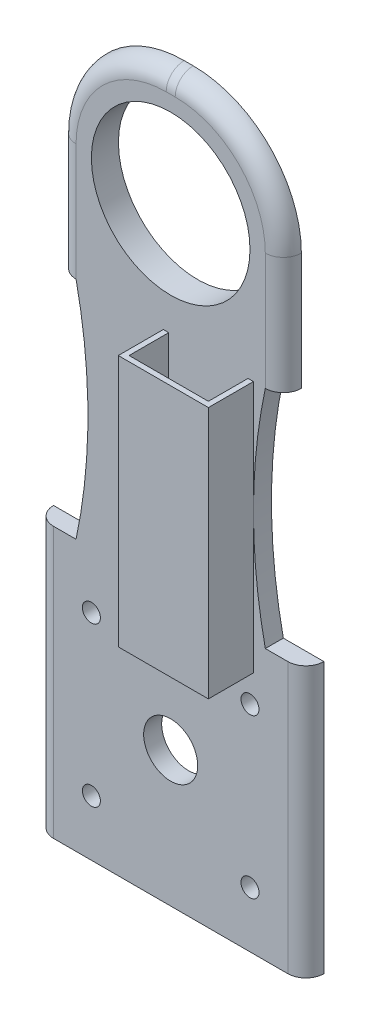
ISO-10303-21;
HEADER;
FILE_DESCRIPTION(('STEP AP214'),'2;1');
FILE_NAME('part.step','',(''),(''),'','','');
FILE_SCHEMA(('AUTOMOTIVE_DESIGN { 1 0 10303 214 1 1 1 1 }'));
ENDSEC;
DATA;
#1=APPLICATION_CONTEXT('core data for automotive mechanical design processes');
#2=APPLICATION_PROTOCOL_DEFINITION('international standard','automotive_design',2000,#1);
#3=PRODUCT_CONTEXT('',#1,'mechanical');
#4=PRODUCT('Part','Part','',(#3));
#5=PRODUCT_RELATED_PRODUCT_CATEGORY('part','',(#4));
#6=PRODUCT_DEFINITION_FORMATION('','',#4);
#7=PRODUCT_DEFINITION_CONTEXT('part definition',#1,'design');
#8=PRODUCT_DEFINITION('design','',#6,#7);
#9=PRODUCT_DEFINITION_SHAPE('','',#8);
#10=(LENGTH_UNIT() NAMED_UNIT(*) SI_UNIT(.MILLI.,.METRE.));
#11=(NAMED_UNIT(*) PLANE_ANGLE_UNIT() SI_UNIT($,.RADIAN.));
#12=(NAMED_UNIT(*) SI_UNIT($,.STERADIAN.) SOLID_ANGLE_UNIT());
#13=UNCERTAINTY_MEASURE_WITH_UNIT(LENGTH_MEASURE(1.E-05),#10,'distance_accuracy_value','');
#14=(GEOMETRIC_REPRESENTATION_CONTEXT(3) GLOBAL_UNCERTAINTY_ASSIGNED_CONTEXT((#13)) GLOBAL_UNIT_ASSIGNED_CONTEXT((#10,
#11,#12)) REPRESENTATION_CONTEXT('',''));
#15=CARTESIAN_POINT('',(0.,0.,0.));
#16=DIRECTION('',(0.,0.,1.));
#17=DIRECTION('',(1.,0.,0.));
#18=AXIS2_PLACEMENT_3D('',#15,#16,#17);
#19=CARTESIAN_POINT('',(10.9010106738399,-22.225,0.));
#20=DIRECTION('',(1.,0.,0.));
#21=DIRECTION('',(0.,1.,0.));
#22=AXIS2_PLACEMENT_3D('',#19,#20,#21);
#23=PLANE('',#22);
#24=DIRECTION('',(0.,-1.,0.));
#25=VECTOR('',#24,1.);
#26=CARTESIAN_POINT('',(10.9010106738399,-22.225,8.128));
#27=LINE('',#26,#25);
#28=CARTESIAN_POINT('',(10.90101067384,-15.875,8.128));
#29=VERTEX_POINT('',#28);
#30=CARTESIAN_POINT('',(10.9010106738399,-51.435,8.128));
#31=VERTEX_POINT('',#30);
#32=EDGE_CURVE('E84',#29,#31,#27,.T.);
#33=ORIENTED_EDGE('',*,*,#32,.F.);
#34=DIRECTION('',(0.,0.,1.));
#35=VECTOR('',#34,1.);
#36=CARTESIAN_POINT('',(10.90101067384,-15.875,8.89000000000002));
#37=LINE('',#36,#35);
#38=CARTESIAN_POINT('',(10.90101067384,-15.875,2.54));
#39=VERTEX_POINT('',#38);
#40=EDGE_CURVE('E530',#39,#29,#37,.T.);
#41=ORIENTED_EDGE('',*,*,#40,.F.);
#42=DIRECTION('',(0.,1.,0.));
#43=VECTOR('',#42,1.);
#44=CARTESIAN_POINT('',(10.9010106738399,-15.875,2.54));
#45=LINE('',#44,#43);
#46=CARTESIAN_POINT('',(10.9010106738399,-22.225,2.54));
#47=VERTEX_POINT('',#46);
#48=EDGE_CURVE('E253',#47,#39,#45,.T.);
#49=ORIENTED_EDGE('',*,*,#48,.F.);
#50=DIRECTION('',(0.,0.,1.));
#51=VECTOR('',#50,1.);
#52=CARTESIAN_POINT('',(10.9010106738399,-22.225,0.));
#53=LINE('',#52,#51);
#54=CARTESIAN_POINT('',(10.9010106738399,-22.225,0.));
#55=VERTEX_POINT('',#54);
#56=EDGE_CURVE('E308',#55,#47,#53,.T.);
#57=ORIENTED_EDGE('',*,*,#56,.F.);
#58=DIRECTION('',(0.,1.,0.));
#59=VECTOR('',#58,1.);
#60=CARTESIAN_POINT('',(10.9010106738399,-22.225,0.));
#61=LINE('',#60,#59);
#62=CARTESIAN_POINT('',(10.9010106738399,-29.591,0.));
#63=VERTEX_POINT('',#62);
#64=EDGE_CURVE('E292',#63,#55,#61,.T.);
#65=ORIENTED_EDGE('',*,*,#64,.F.);
#66=DIRECTION('',(0.,0.,1.));
#67=VECTOR('',#66,1.);
#68=CARTESIAN_POINT('',(10.9010106738399,-29.591,0.));
#69=LINE('',#68,#67);
#70=CARTESIAN_POINT('',(10.9010106738399,-29.591,2.54));
#71=VERTEX_POINT('',#70);
#72=EDGE_CURVE('E311',#63,#71,#69,.T.);
#73=ORIENTED_EDGE('',*,*,#72,.T.);
#74=CARTESIAN_POINT('',(10.90101067384,-51.435,2.54));
#75=VERTEX_POINT('',#74);
#76=EDGE_CURVE('E515',#75,#71,#45,.T.);
#77=ORIENTED_EDGE('',*,*,#76,.F.);
#78=DIRECTION('',(0.,0.,1.));
#79=VECTOR('',#78,1.);
#80=CARTESIAN_POINT('',(10.9010106738399,-51.435,8.89));
#81=LINE('',#80,#79);
#82=EDGE_CURVE('E80',#75,#31,#81,.T.);
#83=ORIENTED_EDGE('',*,*,#82,.T.);
#84=EDGE_LOOP('',(#33,#41,#49,#57,#65,#73,#77,#83));
#85=FACE_BOUND('',#84,.T.);
#86=ADVANCED_FACE('F65',(#85),#23,.F.);
#87=CARTESIAN_POINT('',(-0.274989326160059,-15.875,8.89));
#88=DIRECTION('',(1.,0.,0.));
#89=DIRECTION('',(0.,1.,0.));
#90=AXIS2_PLACEMENT_3D('',#87,#88,#89);
#91=PLANE('',#90);
#92=DIRECTION('',(0.,0.,-1.));
#93=VECTOR('',#92,1.);
#94=CARTESIAN_POINT('',(-0.274989326160028,-15.875,8.89));
#95=LINE('',#94,#93);
#96=CARTESIAN_POINT('',(-0.274989326160028,-15.875,8.128));
#97=VERTEX_POINT('',#96);
#98=CARTESIAN_POINT('',(-0.274989326160027,-15.875,2.54));
#99=VERTEX_POINT('',#98);
#100=EDGE_CURVE('E254',#97,#99,#95,.T.);
#101=ORIENTED_EDGE('',*,*,#100,.F.);
#102=DIRECTION('',(0.,-1.,0.));
#103=VECTOR('',#102,1.);
#104=CARTESIAN_POINT('',(-0.274989326160059,-15.875,8.128));
#105=LINE('',#104,#103);
#106=CARTESIAN_POINT('',(-0.274989326160055,-51.435,8.128));
#107=VERTEX_POINT('',#106);
#108=EDGE_CURVE('E12',#97,#107,#105,.T.);
#109=ORIENTED_EDGE('',*,*,#108,.T.);
#110=DIRECTION('',(0.,0.,-1.));
#111=VECTOR('',#110,1.);
#112=CARTESIAN_POINT('',(-0.274989326160056,-51.435,8.89));
#113=LINE('',#112,#111);
#114=CARTESIAN_POINT('',(-0.274989326160055,-51.435,2.54));
#115=VERTEX_POINT('',#114);
#116=EDGE_CURVE('E233',#107,#115,#113,.T.);
#117=ORIENTED_EDGE('',*,*,#116,.T.);
#118=DIRECTION('',(0.,-1.,0.));
#119=VECTOR('',#118,1.);
#120=CARTESIAN_POINT('',(-0.274989326160059,-15.875,2.54));
#121=LINE('',#120,#119);
#122=EDGE_CURVE('E236',#99,#115,#121,.T.);
#123=ORIENTED_EDGE('',*,*,#122,.F.);
#124=EDGE_LOOP('',(#101,#109,#117,#123));
#125=FACE_BOUND('',#124,.T.);
#126=ADVANCED_FACE('F235',(#125),#91,.T.);
#127=CARTESIAN_POINT('',(0.635000000000004,0.635000000000004,0.));
#128=DIRECTION('',(0.,0.,-1.));
#129=DIRECTION('',(-1.,0.,0.));
#130=AXIS2_PLACEMENT_3D('',#127,#128,#129);
#131=PLANE('',#130);
#132=DIRECTION('',(0.,-1.,0.));
#133=VECTOR('',#132,1.);
#134=CARTESIAN_POINT('',(3.53501067383994,-22.225,0.));
#135=LINE('',#134,#133);
#136=CARTESIAN_POINT('',(3.53501067383994,-22.225,0.));
#137=VERTEX_POINT('',#136);
#138=CARTESIAN_POINT('',(3.53501067383994,-29.591,0.));
#139=VERTEX_POINT('',#138);
#140=EDGE_CURVE('E285',#137,#139,#135,.T.);
#141=ORIENTED_EDGE('',*,*,#140,.T.);
#142=DIRECTION('',(1.,0.,0.));
#143=VECTOR('',#142,1.);
#144=CARTESIAN_POINT('',(3.53501067383994,-29.591,0.));
#145=LINE('',#144,#143);
#146=EDGE_CURVE('E288',#139,#63,#145,.T.);
#147=ORIENTED_EDGE('',*,*,#146,.T.);
#148=ORIENTED_EDGE('',*,*,#64,.T.);
#149=DIRECTION('',(-1.,0.,0.));
#150=VECTOR('',#149,1.);
#151=CARTESIAN_POINT('',(3.53501067383994,-22.225,0.));
#152=LINE('',#151,#150);
#153=EDGE_CURVE('E295',#55,#137,#152,.T.);
#154=ORIENTED_EDGE('',*,*,#153,.T.);
#155=EDGE_LOOP('',(#141,#147,#148,#154));
#156=FACE_BOUND('',#155,.T.);
#157=CARTESIAN_POINT('',(0.,-66.675,0.));
#158=DIRECTION('',(0.,0.,1.));
#159=DIRECTION('',(1.,0.,0.));
#160=AXIS2_PLACEMENT_3D('',#157,#158,#159);
#161=CIRCLE('',#160,3.81);
#162=CARTESIAN_POINT('',(3.81,-66.675,0.));
#163=VERTEX_POINT('',#162);
#164=EDGE_CURVE('E329',#163,#163,#161,.T.);
#165=ORIENTED_EDGE('',*,*,#164,.T.);
#166=EDGE_LOOP('',(#165));
#167=FACE_BOUND('',#166,.T.);
#168=CARTESIAN_POINT('',(-11.176,-77.851,0.));
#169=DIRECTION('',(0.,0.,1.));
#170=DIRECTION('',(1.,0.,0.));
#171=AXIS2_PLACEMENT_3D('',#168,#169,#170);
#172=CIRCLE('',#171,1.27);
#173=CARTESIAN_POINT('',(-9.90600000000001,-77.851,0.));
#174=VERTEX_POINT('',#173);
#175=EDGE_CURVE('E336',#174,#174,#172,.T.);
#176=ORIENTED_EDGE('',*,*,#175,.T.);
#177=EDGE_LOOP('',(#176));
#178=FACE_BOUND('',#177,.T.);
#179=CARTESIAN_POINT('',(11.176,-55.499,0.));
#180=DIRECTION('',(0.,0.,1.));
#181=DIRECTION('',(1.,0.,0.));
#182=AXIS2_PLACEMENT_3D('',#179,#180,#181);
#183=CIRCLE('',#182,1.27);
#184=CARTESIAN_POINT('',(12.446,-55.499,0.));
#185=VERTEX_POINT('',#184);
#186=EDGE_CURVE('E348',#185,#185,#183,.T.);
#187=ORIENTED_EDGE('',*,*,#186,.T.);
#188=EDGE_LOOP('',(#187));
#189=FACE_BOUND('',#188,.T.);
#190=DIRECTION('',(0.,1.,0.));
#191=VECTOR('',#190,1.);
#192=CARTESIAN_POINT('',(15.875,-15.875,0.));
#193=LINE('',#192,#191);
#194=CARTESIAN_POINT('',(15.875,-15.875,0.));
#195=VERTEX_POINT('',#194);
#196=CARTESIAN_POINT('',(15.875,0.634999999999897,0.));
#197=VERTEX_POINT('',#196);
#198=EDGE_CURVE('E359',#195,#197,#193,.T.);
#199=ORIENTED_EDGE('',*,*,#198,.F.);
#200=DIRECTION('',(1.,0.,0.));
#201=VECTOR('',#200,1.);
#202=CARTESIAN_POINT('',(15.875,-15.875,0.));
#203=LINE('',#202,#201);
#204=CARTESIAN_POINT('',(13.335,-15.875,0.));
#205=VERTEX_POINT('',#204);
#206=EDGE_CURVE('E363',#205,#195,#203,.T.);
#207=ORIENTED_EDGE('',*,*,#206,.F.);
#208=CARTESIAN_POINT('',(87.8630106738399,-31.75,0.));
#209=DIRECTION('',(0.,0.,-1.));
#210=DIRECTION('',(1.,0.,0.));
#211=AXIS2_PLACEMENT_3D('',#208,#209,#210);
#212=CIRCLE('',#211,76.2);
#213=CARTESIAN_POINT('',(13.335,-47.625,0.));
#214=VERTEX_POINT('',#213);
#215=EDGE_CURVE('E406',#214,#205,#212,.T.);
#216=ORIENTED_EDGE('',*,*,#215,.F.);
#217=DIRECTION('',(-1.,0.,0.));
#218=VECTOR('',#217,1.);
#219=CARTESIAN_POINT('',(19.05,-47.625,0.));
#220=LINE('',#219,#218);
#221=CARTESIAN_POINT('',(19.05,-47.625,0.));
#222=VERTEX_POINT('',#221);
#223=EDGE_CURVE('E404',#222,#214,#220,.T.);
#224=ORIENTED_EDGE('',*,*,#223,.F.);
#225=DIRECTION('',(0.,1.,0.));
#226=VECTOR('',#225,1.);
#227=CARTESIAN_POINT('',(19.05,-85.725,0.));
#228=LINE('',#227,#226);
#229=CARTESIAN_POINT('',(19.05,-85.725,0.));
#230=VERTEX_POINT('',#229);
#231=EDGE_CURVE('E401',#230,#222,#228,.T.);
#232=ORIENTED_EDGE('',*,*,#231,.F.);
#233=DIRECTION('',(1.,0.,0.));
#234=VECTOR('',#233,1.);
#235=CARTESIAN_POINT('',(19.05,-85.725,0.));
#236=LINE('',#235,#234);
#237=CARTESIAN_POINT('',(-19.05,-85.725,0.));
#238=VERTEX_POINT('',#237);
#239=EDGE_CURVE('E399',#238,#230,#236,.T.);
#240=ORIENTED_EDGE('',*,*,#239,.F.);
#241=DIRECTION('',(0.,-1.,0.));
#242=VECTOR('',#241,1.);
#243=CARTESIAN_POINT('',(-19.05,-85.725,0.));
#244=LINE('',#243,#242);
#245=CARTESIAN_POINT('',(-19.05,-47.625,0.));
#246=VERTEX_POINT('',#245);
#247=EDGE_CURVE('E396',#246,#238,#244,.T.);
#248=ORIENTED_EDGE('',*,*,#247,.F.);
#249=DIRECTION('',(-1.,0.,0.));
#250=VECTOR('',#249,1.);
#251=CARTESIAN_POINT('',(-13.335,-47.625,0.));
#252=LINE('',#251,#250);
#253=CARTESIAN_POINT('',(-13.335,-47.625,0.));
#254=VERTEX_POINT('',#253);
#255=EDGE_CURVE('E394',#254,#246,#252,.T.);
#256=ORIENTED_EDGE('',*,*,#255,.F.);
#257=CARTESIAN_POINT('',(-87.8630106738399,-31.75,0.));
#258=DIRECTION('',(0.,0.,-1.));
#259=DIRECTION('',(-1.,0.,0.));
#260=AXIS2_PLACEMENT_3D('',#257,#258,#259);
#261=CIRCLE('',#260,76.2);
#262=CARTESIAN_POINT('',(-13.335,-15.875,0.));
#263=VERTEX_POINT('',#262);
#264=EDGE_CURVE('E392',#263,#254,#261,.T.);
#265=ORIENTED_EDGE('',*,*,#264,.F.);
#266=DIRECTION('',(1.,0.,0.));
#267=VECTOR('',#266,1.);
#268=CARTESIAN_POINT('',(-13.335,-15.875,0.));
#269=LINE('',#268,#267);
#270=CARTESIAN_POINT('',(-15.875,-15.875,0.));
#271=VERTEX_POINT('',#270);
#272=EDGE_CURVE('E390',#271,#263,#269,.T.);
#273=ORIENTED_EDGE('',*,*,#272,.F.);
#274=DIRECTION('',(0.,-1.,0.));
#275=VECTOR('',#274,1.);
#276=CARTESIAN_POINT('',(-15.875,-15.875,0.));
#277=LINE('',#276,#275);
#278=CARTESIAN_POINT('',(-15.875,0.634999999999894,0.));
#279=VERTEX_POINT('',#278);
#280=EDGE_CURVE('E387',#279,#271,#277,.T.);
#281=ORIENTED_EDGE('',*,*,#280,.F.);
#282=CARTESIAN_POINT('',(-0.635000000000004,0.635000000000002,0.));
#283=DIRECTION('',(0.,0.,1.));
#284=DIRECTION('',(-1.,0.,0.));
#285=AXIS2_PLACEMENT_3D('',#282,#283,#284);
#286=CIRCLE('',#285,15.24);
#287=CARTESIAN_POINT('',(-0.634999999999896,15.875,0.));
#288=VERTEX_POINT('',#287);
#289=EDGE_CURVE('E384',#288,#279,#286,.T.);
#290=ORIENTED_EDGE('',*,*,#289,.F.);
#291=DIRECTION('',(-1.,0.,0.));
#292=VECTOR('',#291,1.);
#293=CARTESIAN_POINT('',(0.634999999999891,15.875,0.));
#294=LINE('',#293,#292);
#295=CARTESIAN_POINT('',(0.634999999999891,15.875,0.));
#296=VERTEX_POINT('',#295);
#297=EDGE_CURVE('E381',#296,#288,#294,.T.);
#298=ORIENTED_EDGE('',*,*,#297,.F.);
#299=CARTESIAN_POINT('',(0.635000000000004,0.635000000000004,0.));
#300=DIRECTION('',(0.,0.,1.));
#301=DIRECTION('',(-1.,0.,0.));
#302=AXIS2_PLACEMENT_3D('',#299,#300,#301);
#303=CIRCLE('',#302,15.24);
#304=EDGE_CURVE('E378',#197,#296,#303,.T.);
#305=ORIENTED_EDGE('',*,*,#304,.F.);
#306=EDGE_LOOP('',(#199,#207,#216,#224,#232,#240,#248,#256,#265,#273,#281,#290,#298,#305));
#307=FACE_BOUND('',#306,.T.);
#308=CARTESIAN_POINT('',(11.176,-77.851,0.));
#309=DIRECTION('',(0.,0.,1.));
#310=DIRECTION('',(1.,0.,0.));
#311=AXIS2_PLACEMENT_3D('',#308,#309,#310);
#312=CIRCLE('',#311,1.27);
#313=CARTESIAN_POINT('',(12.446,-77.851,0.));
#314=VERTEX_POINT('',#313);
#315=EDGE_CURVE('E342',#314,#314,#312,.T.);
#316=ORIENTED_EDGE('',*,*,#315,.T.);
#317=EDGE_LOOP('',(#316));
#318=FACE_BOUND('',#317,.T.);
#319=CARTESIAN_POINT('',(-11.176,-55.499,0.));
#320=DIRECTION('',(0.,0.,1.));
#321=DIRECTION('',(1.,0.,0.));
#322=AXIS2_PLACEMENT_3D('',#319,#320,#321);
#323=CIRCLE('',#322,1.27);
#324=CARTESIAN_POINT('',(-9.90600000000001,-55.499,0.));
#325=VERTEX_POINT('',#324);
#326=EDGE_CURVE('E328',#325,#325,#323,.T.);
#327=ORIENTED_EDGE('',*,*,#326,.T.);
#328=EDGE_LOOP('',(#327));
#329=FACE_BOUND('',#328,.T.);
#330=CARTESIAN_POINT('',(0.,0.,0.));
#331=DIRECTION('',(0.,0.,-1.));
#332=DIRECTION('',(-1.,0.,0.));
#333=AXIS2_PLACEMENT_3D('',#330,#331,#332);
#334=CIRCLE('',#333,13.716);
#335=CARTESIAN_POINT('',(-13.716,0.,0.));
#336=VERTEX_POINT('',#335);
#337=EDGE_CURVE('E318',#336,#336,#334,.T.);
#338=ORIENTED_EDGE('',*,*,#337,.F.);
#339=EDGE_LOOP('',(#338));
#340=FACE_BOUND('',#339,.T.);
#341=ADVANCED_FACE('F490',(#156,#167,#178,#189,#307,#318,#329,#340),#131,.T.);
#342=CARTESIAN_POINT('',(0.635000000000004,0.635000000000004,2.54));
#343=DIRECTION('',(0.,0.,-1.));
#344=DIRECTION('',(-1.,0.,0.));
#345=AXIS2_PLACEMENT_3D('',#342,#343,#344);
#346=PLANE('',#345);
#347=ORIENTED_EDGE('',*,*,#48,.T.);
#348=DIRECTION('',(-1.,0.,0.));
#349=VECTOR('',#348,1.);
#350=CARTESIAN_POINT('',(-1.03698932616006,-15.875,2.54));
#351=LINE('',#350,#349);
#352=CARTESIAN_POINT('',(11.6630106738399,-15.875,2.54));
#353=VERTEX_POINT('',#352);
#354=EDGE_CURVE('E272',#353,#39,#351,.T.);
#355=ORIENTED_EDGE('',*,*,#354,.F.);
#356=DIRECTION('',(0.,1.,0.));
#357=VECTOR('',#356,1.);
#358=CARTESIAN_POINT('',(11.6630106738399,-15.875,2.54));
#359=LINE('',#358,#357);
#360=CARTESIAN_POINT('',(11.6630106738399,-31.75,2.54));
#361=VERTEX_POINT('',#360);
#362=EDGE_CURVE('E260',#361,#353,#359,.T.);
#363=ORIENTED_EDGE('',*,*,#362,.F.);
#364=CARTESIAN_POINT('',(87.8630106738399,-31.75,2.54));
#365=DIRECTION('',(0.,0.,-1.));
#366=DIRECTION('',(1.,0.,0.));
#367=AXIS2_PLACEMENT_3D('',#364,#365,#366);
#368=CIRCLE('',#367,76.2);
#369=CARTESIAN_POINT('',(13.335,-15.875,2.54));
#370=VERTEX_POINT('',#369);
#371=EDGE_CURVE('E371',#361,#370,#368,.T.);
#372=ORIENTED_EDGE('',*,*,#371,.T.);
#373=DIRECTION('',(0.,1.,0.));
#374=VECTOR('',#373,1.);
#375=CARTESIAN_POINT('',(13.335,0.635000000000004,2.54));
#376=LINE('',#375,#374);
#377=CARTESIAN_POINT('',(13.335,0.634999999999897,2.54));
#378=VERTEX_POINT('',#377);
#379=EDGE_CURVE('E442',#370,#378,#376,.T.);
#380=ORIENTED_EDGE('',*,*,#379,.T.);
#381=CARTESIAN_POINT('',(0.635000000000004,0.635000000000004,2.54));
#382=DIRECTION('',(0.,0.,-1.));
#383=DIRECTION('',(-1.,0.,0.));
#384=AXIS2_PLACEMENT_3D('',#381,#382,#383);
#385=CIRCLE('',#384,12.7);
#386=CARTESIAN_POINT('',(0.63499999999991,13.335,2.54));
#387=VERTEX_POINT('',#386);
#388=EDGE_CURVE('E440',#378,#387,#385,.F.);
#389=ORIENTED_EDGE('',*,*,#388,.T.);
#390=DIRECTION('',(-1.,0.,0.));
#391=VECTOR('',#390,1.);
#392=CARTESIAN_POINT('',(0.635000000000004,13.335,2.54));
#393=LINE('',#392,#391);
#394=CARTESIAN_POINT('',(-0.634999999999896,13.335,2.54));
#395=VERTEX_POINT('',#394);
#396=EDGE_CURVE('E438',#387,#395,#393,.T.);
#397=ORIENTED_EDGE('',*,*,#396,.T.);
#398=CARTESIAN_POINT('',(-0.635000000000004,0.635000000000002,2.54));
#399=DIRECTION('',(0.,0.,-1.));
#400=DIRECTION('',(-1.,0.,0.));
#401=AXIS2_PLACEMENT_3D('',#398,#399,#400);
#402=CIRCLE('',#401,12.7);
#403=CARTESIAN_POINT('',(-13.335,0.634999999999912,2.54));
#404=VERTEX_POINT('',#403);
#405=EDGE_CURVE('E436',#395,#404,#402,.F.);
#406=ORIENTED_EDGE('',*,*,#405,.T.);
#407=DIRECTION('',(0.,-1.,0.));
#408=VECTOR('',#407,1.);
#409=CARTESIAN_POINT('',(-13.335,0.635000000000004,2.54));
#410=LINE('',#409,#408);
#411=CARTESIAN_POINT('',(-13.335,-15.875,2.54));
#412=VERTEX_POINT('',#411);
#413=EDGE_CURVE('E434',#404,#412,#410,.T.);
#414=ORIENTED_EDGE('',*,*,#413,.T.);
#415=CARTESIAN_POINT('',(-87.8630106738399,-31.75,2.54));
#416=DIRECTION('',(0.,0.,-1.));
#417=DIRECTION('',(-1.,0.,0.));
#418=AXIS2_PLACEMENT_3D('',#415,#416,#417);
#419=CIRCLE('',#418,76.2);
#420=CARTESIAN_POINT('',(-13.335,-47.625,2.54));
#421=VERTEX_POINT('',#420);
#422=EDGE_CURVE('E360',#412,#421,#419,.T.);
#423=ORIENTED_EDGE('',*,*,#422,.T.);
#424=DIRECTION('',(-1.,0.,0.));
#425=VECTOR('',#424,1.);
#426=CARTESIAN_POINT('',(-13.335,-47.625,2.54));
#427=LINE('',#426,#425);
#428=CARTESIAN_POINT('',(-16.51,-47.625,2.54));
#429=VERTEX_POINT('',#428);
#430=EDGE_CURVE('E362',#421,#429,#427,.T.);
#431=ORIENTED_EDGE('',*,*,#430,.T.);
#432=DIRECTION('',(0.,-1.,0.));
#433=VECTOR('',#432,1.);
#434=CARTESIAN_POINT('',(-16.51,0.635000000000005,2.54));
#435=LINE('',#434,#433);
#436=CARTESIAN_POINT('',(-16.51,-85.725,2.54));
#437=VERTEX_POINT('',#436);
#438=EDGE_CURVE('E420',#429,#437,#435,.T.);
#439=ORIENTED_EDGE('',*,*,#438,.T.);
#440=DIRECTION('',(1.,0.,0.));
#441=VECTOR('',#440,1.);
#442=CARTESIAN_POINT('',(19.05,-85.725,2.54));
#443=LINE('',#442,#441);
#444=CARTESIAN_POINT('',(16.51,-85.725,2.54));
#445=VERTEX_POINT('',#444);
#446=EDGE_CURVE('E366',#437,#445,#443,.T.);
#447=ORIENTED_EDGE('',*,*,#446,.T.);
#448=DIRECTION('',(0.,1.,0.));
#449=VECTOR('',#448,1.);
#450=CARTESIAN_POINT('',(16.51,0.635000000000004,2.54));
#451=LINE('',#450,#449);
#452=CARTESIAN_POINT('',(16.51,-47.625,2.54));
#453=VERTEX_POINT('',#452);
#454=EDGE_CURVE('E423',#445,#453,#451,.T.);
#455=ORIENTED_EDGE('',*,*,#454,.T.);
#456=DIRECTION('',(-1.,0.,0.));
#457=VECTOR('',#456,1.);
#458=CARTESIAN_POINT('',(19.05,-47.625,2.54));
#459=LINE('',#458,#457);
#460=CARTESIAN_POINT('',(13.335,-47.625,2.54));
#461=VERTEX_POINT('',#460);
#462=EDGE_CURVE('E369',#453,#461,#459,.T.);
#463=ORIENTED_EDGE('',*,*,#462,.T.);
#464=EDGE_CURVE('E372',#461,#361,#368,.T.);
#465=ORIENTED_EDGE('',*,*,#464,.T.);
#466=CARTESIAN_POINT('',(11.6630106738399,-51.435,2.54));
#467=VERTEX_POINT('',#466);
#468=EDGE_CURVE('E264',#467,#361,#359,.T.);
#469=ORIENTED_EDGE('',*,*,#468,.F.);
#470=DIRECTION('',(1.,0.,0.));
#471=VECTOR('',#470,1.);
#472=CARTESIAN_POINT('',(-1.03698932616006,-51.435,2.54));
#473=LINE('',#472,#471);
#474=EDGE_CURVE('E261',#75,#467,#473,.T.);
#475=ORIENTED_EDGE('',*,*,#474,.F.);
#476=ORIENTED_EDGE('',*,*,#76,.T.);
#477=DIRECTION('',(1.,0.,0.));
#478=VECTOR('',#477,1.);
#479=CARTESIAN_POINT('',(3.53501067383994,-29.591,2.54));
#480=LINE('',#479,#478);
#481=CARTESIAN_POINT('',(3.53501067383994,-29.591,2.54));
#482=VERTEX_POINT('',#481);
#483=EDGE_CURVE('E300',#482,#71,#480,.T.);
#484=ORIENTED_EDGE('',*,*,#483,.F.);
#485=DIRECTION('',(0.,-1.,0.));
#486=VECTOR('',#485,1.);
#487=CARTESIAN_POINT('',(3.53501067383994,-22.225,2.54));
#488=LINE('',#487,#486);
#489=CARTESIAN_POINT('',(3.53501067383994,-22.225,2.54));
#490=VERTEX_POINT('',#489);
#491=EDGE_CURVE('E284',#490,#482,#488,.T.);
#492=ORIENTED_EDGE('',*,*,#491,.F.);
#493=DIRECTION('',(-1.,0.,0.));
#494=VECTOR('',#493,1.);
#495=CARTESIAN_POINT('',(3.53501067383994,-22.225,2.54));
#496=LINE('',#495,#494);
#497=EDGE_CURVE('E289',#47,#490,#496,.T.);
#498=ORIENTED_EDGE('',*,*,#497,.F.);
#499=EDGE_LOOP('',(#347,#355,#363,#372,#380,#389,#397,#406,#414,#423,#431,#439,#447,#455,#463,
#465,#469,#475,#476,#484,#492,#498));
#500=FACE_BOUND('',#499,.T.);
#501=CARTESIAN_POINT('',(-1.03698932616006,-15.875,2.54));
#502=VERTEX_POINT('',#501);
#503=EDGE_CURVE('E252',#99,#502,#351,.T.);
#504=ORIENTED_EDGE('',*,*,#503,.F.);
#505=ORIENTED_EDGE('',*,*,#122,.T.);
#506=CARTESIAN_POINT('',(-1.03698932616006,-51.435,2.54));
#507=VERTEX_POINT('',#506);
#508=EDGE_CURVE('E249',#507,#115,#473,.T.);
#509=ORIENTED_EDGE('',*,*,#508,.F.);
#510=DIRECTION('',(0.,-1.,0.));
#511=VECTOR('',#510,1.);
#512=CARTESIAN_POINT('',(-1.03698932616006,-15.875,2.54));
#513=LINE('',#512,#511);
#514=EDGE_CURVE('E267',#502,#507,#513,.T.);
#515=ORIENTED_EDGE('',*,*,#514,.F.);
#516=EDGE_LOOP('',(#504,#505,#509,#515));
#517=FACE_BOUND('',#516,.T.);
#518=CARTESIAN_POINT('',(0.,0.,2.54));
#519=DIRECTION('',(0.,0.,1.));
#520=DIRECTION('',(1.,0.,0.));
#521=AXIS2_PLACEMENT_3D('',#518,#519,#520);
#522=CIRCLE('',#521,11.176);
#523=CARTESIAN_POINT('',(11.176,0.,2.54));
#524=VERTEX_POINT('',#523);
#525=EDGE_CURVE('E354',#524,#524,#522,.T.);
#526=ORIENTED_EDGE('',*,*,#525,.F.);
#527=EDGE_LOOP('',(#526));
#528=FACE_BOUND('',#527,.T.);
#529=CARTESIAN_POINT('',(11.176,-55.499,2.54));
#530=DIRECTION('',(0.,0.,1.));
#531=DIRECTION('',(1.,0.,0.));
#532=AXIS2_PLACEMENT_3D('',#529,#530,#531);
#533=CIRCLE('',#532,1.27);
#534=CARTESIAN_POINT('',(12.446,-55.499,2.54));
#535=VERTEX_POINT('',#534);
#536=EDGE_CURVE('E351',#535,#535,#533,.T.);
#537=ORIENTED_EDGE('',*,*,#536,.F.);
#538=EDGE_LOOP('',(#537));
#539=FACE_BOUND('',#538,.T.);
#540=CARTESIAN_POINT('',(11.176,-77.851,2.54));
#541=DIRECTION('',(0.,0.,1.));
#542=DIRECTION('',(1.,0.,0.));
#543=AXIS2_PLACEMENT_3D('',#540,#541,#542);
#544=CIRCLE('',#543,1.27);
#545=CARTESIAN_POINT('',(12.446,-77.851,2.54));
#546=VERTEX_POINT('',#545);
#547=EDGE_CURVE('E345',#546,#546,#544,.T.);
#548=ORIENTED_EDGE('',*,*,#547,.F.);
#549=EDGE_LOOP('',(#548));
#550=FACE_BOUND('',#549,.T.);
#551=CARTESIAN_POINT('',(-11.176,-77.851,2.54));
#552=DIRECTION('',(0.,0.,1.));
#553=DIRECTION('',(1.,0.,0.));
#554=AXIS2_PLACEMENT_3D('',#551,#552,#553);
#555=CIRCLE('',#554,1.27);
#556=CARTESIAN_POINT('',(-9.90600000000001,-77.851,2.54));
#557=VERTEX_POINT('',#556);
#558=EDGE_CURVE('E339',#557,#557,#555,.T.);
#559=ORIENTED_EDGE('',*,*,#558,.F.);
#560=EDGE_LOOP('',(#559));
#561=FACE_BOUND('',#560,.T.);
#562=CARTESIAN_POINT('',(-11.176,-55.499,2.54));
#563=DIRECTION('',(0.,0.,1.));
#564=DIRECTION('',(1.,0.,0.));
#565=AXIS2_PLACEMENT_3D('',#562,#563,#564);
#566=CIRCLE('',#565,1.27);
#567=CARTESIAN_POINT('',(-9.90600000000001,-55.499,2.54));
#568=VERTEX_POINT('',#567);
#569=EDGE_CURVE('E333',#568,#568,#566,.T.);
#570=ORIENTED_EDGE('',*,*,#569,.F.);
#571=EDGE_LOOP('',(#570));
#572=FACE_BOUND('',#571,.T.);
#573=CARTESIAN_POINT('',(0.,-66.675,2.54));
#574=DIRECTION('',(0.,0.,1.));
#575=DIRECTION('',(1.,0.,0.));
#576=AXIS2_PLACEMENT_3D('',#573,#574,#575);
#577=CIRCLE('',#576,3.81);
#578=CARTESIAN_POINT('',(3.81,-66.675,2.54));
#579=VERTEX_POINT('',#578);
#580=EDGE_CURVE('E325',#579,#579,#577,.T.);
#581=ORIENTED_EDGE('',*,*,#580,.F.);
#582=EDGE_LOOP('',(#581));
#583=FACE_BOUND('',#582,.T.);
#584=ADVANCED_FACE('F246',(#500,#517,#528,#539,#550,#561,#572,#583),#346,.F.);
#585=CARTESIAN_POINT('',(-13.335,-15.875,2.54));
#586=DIRECTION('',(0.,1.,0.));
#587=DIRECTION('',(-1.,0.,0.));
#588=AXIS2_PLACEMENT_3D('',#585,#586,#587);
#589=PLANE('',#588);
#590=DIRECTION('',(0.,0.,-1.));
#591=VECTOR('',#590,1.);
#592=CARTESIAN_POINT('',(-13.335,-15.875,2.54));
#593=LINE('',#592,#591);
#594=EDGE_CURVE('E417',#412,#263,#593,.T.);
#595=ORIENTED_EDGE('',*,*,#594,.F.);
#596=CARTESIAN_POINT('',(-13.335,-15.875,0.));
#597=DIRECTION('',(0.,1.,0.));
#598=DIRECTION('',(-1.,0.,0.));
#599=AXIS2_PLACEMENT_3D('',#596,#597,#598);
#600=CIRCLE('',#599,2.54);
#601=EDGE_CURVE('E73',#412,#271,#600,.F.);
#602=ORIENTED_EDGE('',*,*,#601,.T.);
#603=ORIENTED_EDGE('',*,*,#272,.T.);
#604=EDGE_LOOP('',(#595,#602,#603));
#605=FACE_BOUND('',#604,.T.);
#606=ADVANCED_FACE('F469',(#605),#589,.F.);
#607=CARTESIAN_POINT('',(-87.8630106738399,-31.75,2.54));
#608=DIRECTION('',(0.,0.,-1.));
#609=DIRECTION('',(-1.,0.,0.));
#610=AXIS2_PLACEMENT_3D('',#607,#608,#609);
#611=CYLINDRICAL_SURFACE('',#610,76.2);
#612=ORIENTED_EDGE('',*,*,#264,.T.);
#613=DIRECTION('',(0.,0.,-1.));
#614=VECTOR('',#613,1.);
#615=CARTESIAN_POINT('',(-13.335,-47.625,2.54));
#616=LINE('',#615,#614);
#617=EDGE_CURVE('E414',#421,#254,#616,.T.);
#618=ORIENTED_EDGE('',*,*,#617,.F.);
#619=ORIENTED_EDGE('',*,*,#422,.F.);
#620=ORIENTED_EDGE('',*,*,#594,.T.);
#621=EDGE_LOOP('',(#612,#618,#619,#620));
#622=FACE_BOUND('',#621,.T.);
#623=ADVANCED_FACE('F473',(#622),#611,.F.);
#624=CARTESIAN_POINT('',(-13.335,-47.625,2.54));
#625=DIRECTION('',(0.,-1.,0.));
#626=DIRECTION('',(1.,0.,0.));
#627=AXIS2_PLACEMENT_3D('',#624,#625,#626);
#628=PLANE('',#627);
#629=ORIENTED_EDGE('',*,*,#255,.T.);
#630=CARTESIAN_POINT('',(-16.51,-47.625,0.));
#631=DIRECTION('',(0.,-1.,0.));
#632=DIRECTION('',(1.,0.,0.));
#633=AXIS2_PLACEMENT_3D('',#630,#631,#632);
#634=CIRCLE('',#633,2.54);
#635=EDGE_CURVE('E432',#246,#429,#634,.F.);
#636=ORIENTED_EDGE('',*,*,#635,.T.);
#637=ORIENTED_EDGE('',*,*,#430,.F.);
#638=ORIENTED_EDGE('',*,*,#617,.T.);
#639=EDGE_LOOP('',(#629,#636,#637,#638));
#640=FACE_BOUND('',#639,.T.);
#641=ADVANCED_FACE('F477',(#640),#628,.F.);
#642=CARTESIAN_POINT('',(19.05,-85.725,2.54));
#643=DIRECTION('',(0.,1.,0.));
#644=DIRECTION('',(0.,0.,1.));
#645=AXIS2_PLACEMENT_3D('',#642,#643,#644);
#646=PLANE('',#645);
#647=ORIENTED_EDGE('',*,*,#239,.T.);
#648=CARTESIAN_POINT('',(16.51,-85.725,0.));
#649=DIRECTION('',(0.,1.,0.));
#650=DIRECTION('',(0.,0.,1.));
#651=AXIS2_PLACEMENT_3D('',#648,#649,#650);
#652=CIRCLE('',#651,2.54);
#653=EDGE_CURVE('E430',#230,#445,#652,.F.);
#654=ORIENTED_EDGE('',*,*,#653,.T.);
#655=ORIENTED_EDGE('',*,*,#446,.F.);
#656=CARTESIAN_POINT('',(-16.51,-85.725,0.));
#657=DIRECTION('',(0.,1.,0.));
#658=DIRECTION('',(0.,0.,1.));
#659=AXIS2_PLACEMENT_3D('',#656,#657,#658);
#660=CIRCLE('',#659,2.54);
#661=EDGE_CURVE('E428',#437,#238,#660,.F.);
#662=ORIENTED_EDGE('',*,*,#661,.T.);
#663=EDGE_LOOP('',(#647,#654,#655,#662));
#664=FACE_BOUND('',#663,.T.);
#665=ADVANCED_FACE('F486',(#664),#646,.F.);
#666=CARTESIAN_POINT('',(19.05,-47.625,2.54));
#667=DIRECTION('',(0.,-1.,0.));
#668=DIRECTION('',(1.,0.,0.));
#669=AXIS2_PLACEMENT_3D('',#666,#667,#668);
#670=PLANE('',#669);
#671=ORIENTED_EDGE('',*,*,#462,.F.);
#672=CARTESIAN_POINT('',(16.51,-47.625,0.));
#673=DIRECTION('',(0.,-1.,0.));
#674=DIRECTION('',(1.,0.,0.));
#675=AXIS2_PLACEMENT_3D('',#672,#673,#674);
#676=CIRCLE('',#675,2.54);
#677=EDGE_CURVE('E426',#453,#222,#676,.F.);
#678=ORIENTED_EDGE('',*,*,#677,.T.);
#679=ORIENTED_EDGE('',*,*,#223,.T.);
#680=DIRECTION('',(0.,0.,-1.));
#681=VECTOR('',#680,1.);
#682=CARTESIAN_POINT('',(13.335,-47.625,2.54));
#683=LINE('',#682,#681);
#684=EDGE_CURVE('E411',#461,#214,#683,.T.);
#685=ORIENTED_EDGE('',*,*,#684,.F.);
#686=EDGE_LOOP('',(#671,#678,#679,#685));
#687=FACE_BOUND('',#686,.T.);
#688=ADVANCED_FACE('F501',(#687),#670,.F.);
#689=CARTESIAN_POINT('',(87.8630106738399,-31.75,2.54));
#690=DIRECTION('',(0.,0.,-1.));
#691=DIRECTION('',(-1.,0.,0.));
#692=AXIS2_PLACEMENT_3D('',#689,#690,#691);
#693=CYLINDRICAL_SURFACE('',#692,76.2);
#694=ORIENTED_EDGE('',*,*,#215,.T.);
#695=DIRECTION('',(0.,0.,-1.));
#696=VECTOR('',#695,1.);
#697=CARTESIAN_POINT('',(13.335,-15.875,2.54));
#698=LINE('',#697,#696);
#699=EDGE_CURVE('E375',#370,#205,#698,.T.);
#700=ORIENTED_EDGE('',*,*,#699,.F.);
#701=ORIENTED_EDGE('',*,*,#371,.F.);
#702=ORIENTED_EDGE('',*,*,#464,.F.);
#703=ORIENTED_EDGE('',*,*,#684,.T.);
#704=EDGE_LOOP('',(#694,#700,#701,#702,#703));
#705=FACE_BOUND('',#704,.T.);
#706=ADVANCED_FACE('F505',(#705),#693,.F.);
#707=CARTESIAN_POINT('',(15.875,-15.875,2.54));
#708=DIRECTION('',(0.,1.,0.));
#709=DIRECTION('',(-1.,0.,0.));
#710=AXIS2_PLACEMENT_3D('',#707,#708,#709);
#711=PLANE('',#710);
#712=ORIENTED_EDGE('',*,*,#206,.T.);
#713=CARTESIAN_POINT('',(13.335,-15.875,0.));
#714=DIRECTION('',(0.,1.,0.));
#715=DIRECTION('',(-1.,0.,0.));
#716=AXIS2_PLACEMENT_3D('',#713,#714,#715);
#717=CIRCLE('',#716,2.54);
#718=EDGE_CURVE('E445',#195,#370,#717,.F.);
#719=ORIENTED_EDGE('',*,*,#718,.T.);
#720=ORIENTED_EDGE('',*,*,#699,.T.);
#721=EDGE_LOOP('',(#712,#719,#720));
#722=FACE_BOUND('',#721,.T.);
#723=ADVANCED_FACE('F599',(#722),#711,.F.);
#724=CARTESIAN_POINT('',(0.,0.,2.54));
#725=DIRECTION('',(0.,0.,-1.));
#726=DIRECTION('',(-1.,0.,0.));
#727=AXIS2_PLACEMENT_3D('',#724,#725,#726);
#728=CYLINDRICAL_SURFACE('',#727,11.176);
#729=ORIENTED_EDGE('',*,*,#525,.T.);
#730=EDGE_LOOP('',(#729));
#731=FACE_BOUND('',#730,.T.);
#732=CARTESIAN_POINT('',(0.,0.,-1.27));
#733=DIRECTION('',(0.,0.,-1.));
#734=DIRECTION('',(-1.,0.,0.));
#735=AXIS2_PLACEMENT_3D('',#732,#733,#734);
#736=CIRCLE('',#735,11.176);
#737=CARTESIAN_POINT('',(-11.176,0.,-1.27));
#738=VERTEX_POINT('',#737);
#739=EDGE_CURVE('E307',#738,#738,#736,.T.);
#740=ORIENTED_EDGE('',*,*,#739,.T.);
#741=EDGE_LOOP('',(#740));
#742=FACE_BOUND('',#741,.T.);
#743=ADVANCED_FACE('F595',(#731,#742),#728,.F.);
#744=CARTESIAN_POINT('',(11.176,-55.499,2.54));
#745=DIRECTION('',(0.,0.,-1.));
#746=DIRECTION('',(-1.,0.,0.));
#747=AXIS2_PLACEMENT_3D('',#744,#745,#746);
#748=CYLINDRICAL_SURFACE('',#747,1.27);
#749=ORIENTED_EDGE('',*,*,#536,.T.);
#750=EDGE_LOOP('',(#749));
#751=FACE_BOUND('',#750,.T.);
#752=ORIENTED_EDGE('',*,*,#186,.F.);
#753=EDGE_LOOP('',(#752));
#754=FACE_BOUND('',#753,.T.);
#755=ADVANCED_FACE('F591',(#751,#754),#748,.F.);
#756=CARTESIAN_POINT('',(11.176,-77.851,2.54));
#757=DIRECTION('',(0.,0.,-1.));
#758=DIRECTION('',(-1.,0.,0.));
#759=AXIS2_PLACEMENT_3D('',#756,#757,#758);
#760=CYLINDRICAL_SURFACE('',#759,1.27);
#761=ORIENTED_EDGE('',*,*,#547,.T.);
#762=EDGE_LOOP('',(#761));
#763=FACE_BOUND('',#762,.T.);
#764=ORIENTED_EDGE('',*,*,#315,.F.);
#765=EDGE_LOOP('',(#764));
#766=FACE_BOUND('',#765,.T.);
#767=ADVANCED_FACE('F587',(#763,#766),#760,.F.);
#768=CARTESIAN_POINT('',(-11.176,-77.851,2.54));
#769=DIRECTION('',(0.,0.,-1.));
#770=DIRECTION('',(-1.,0.,0.));
#771=AXIS2_PLACEMENT_3D('',#768,#769,#770);
#772=CYLINDRICAL_SURFACE('',#771,1.27);
#773=ORIENTED_EDGE('',*,*,#558,.T.);
#774=EDGE_LOOP('',(#773));
#775=FACE_BOUND('',#774,.T.);
#776=ORIENTED_EDGE('',*,*,#175,.F.);
#777=EDGE_LOOP('',(#776));
#778=FACE_BOUND('',#777,.T.);
#779=ADVANCED_FACE('F583',(#775,#778),#772,.F.);
#780=CARTESIAN_POINT('',(-11.176,-55.499,2.54));
#781=DIRECTION('',(0.,0.,-1.));
#782=DIRECTION('',(-1.,0.,0.));
#783=AXIS2_PLACEMENT_3D('',#780,#781,#782);
#784=CYLINDRICAL_SURFACE('',#783,1.27);
#785=ORIENTED_EDGE('',*,*,#569,.T.);
#786=EDGE_LOOP('',(#785));
#787=FACE_BOUND('',#786,.T.);
#788=ORIENTED_EDGE('',*,*,#326,.F.);
#789=EDGE_LOOP('',(#788));
#790=FACE_BOUND('',#789,.T.);
#791=ADVANCED_FACE('F579',(#787,#790),#784,.F.);
#792=CARTESIAN_POINT('',(0.,-66.675,2.54));
#793=DIRECTION('',(0.,0.,-1.));
#794=DIRECTION('',(-1.,0.,0.));
#795=AXIS2_PLACEMENT_3D('',#792,#793,#794);
#796=CYLINDRICAL_SURFACE('',#795,3.81);
#797=ORIENTED_EDGE('',*,*,#580,.T.);
#798=EDGE_LOOP('',(#797));
#799=FACE_BOUND('',#798,.T.);
#800=ORIENTED_EDGE('',*,*,#164,.F.);
#801=EDGE_LOOP('',(#800));
#802=FACE_BOUND('',#801,.T.);
#803=ADVANCED_FACE('F576',(#799,#802),#796,.F.);
#804=CARTESIAN_POINT('',(16.51,0.635000000000004,0.));
#805=DIRECTION('',(0.,1.,0.));
#806=DIRECTION('',(0.,0.,1.));
#807=AXIS2_PLACEMENT_3D('',#804,#805,#806);
#808=CYLINDRICAL_SURFACE('',#807,2.54);
#809=ORIENTED_EDGE('',*,*,#653,.F.);
#810=ORIENTED_EDGE('',*,*,#231,.T.);
#811=ORIENTED_EDGE('',*,*,#677,.F.);
#812=ORIENTED_EDGE('',*,*,#454,.F.);
#813=EDGE_LOOP('',(#809,#810,#811,#812));
#814=FACE_BOUND('',#813,.T.);
#815=ADVANCED_FACE('F497',(#814),#808,.T.);
#816=CARTESIAN_POINT('',(-16.51,0.635000000000005,0.));
#817=DIRECTION('',(0.,-1.,0.));
#818=DIRECTION('',(1.,0.,0.));
#819=AXIS2_PLACEMENT_3D('',#816,#817,#818);
#820=CYLINDRICAL_SURFACE('',#819,2.54);
#821=ORIENTED_EDGE('',*,*,#635,.F.);
#822=ORIENTED_EDGE('',*,*,#247,.T.);
#823=ORIENTED_EDGE('',*,*,#661,.F.);
#824=ORIENTED_EDGE('',*,*,#438,.F.);
#825=EDGE_LOOP('',(#821,#822,#823,#824));
#826=FACE_BOUND('',#825,.T.);
#827=ADVANCED_FACE('F482',(#826),#820,.T.);
#828=CARTESIAN_POINT('',(-13.335,0.635000000000004,0.));
#829=DIRECTION('',(0.,-1.,0.));
#830=DIRECTION('',(0.,0.,-1.));
#831=AXIS2_PLACEMENT_3D('',#828,#829,#830);
#832=CYLINDRICAL_SURFACE('',#831,2.54);
#833=ORIENTED_EDGE('',*,*,#601,.F.);
#834=ORIENTED_EDGE('',*,*,#413,.F.);
#835=CARTESIAN_POINT('',(-13.335,0.634999999999894,0.));
#836=DIRECTION('',(0.,1.,0.));
#837=DIRECTION('',(0.,0.,1.));
#838=AXIS2_PLACEMENT_3D('',#835,#836,#837);
#839=CIRCLE('',#838,2.54);
#840=EDGE_CURVE('E332',#279,#404,#839,.T.);
#841=ORIENTED_EDGE('',*,*,#840,.F.);
#842=ORIENTED_EDGE('',*,*,#280,.T.);
#843=EDGE_LOOP('',(#833,#834,#841,#842));
#844=FACE_BOUND('',#843,.T.);
#845=ADVANCED_FACE('F67',(#844),#832,.T.);
#846=CARTESIAN_POINT('',(-0.635000000000004,0.635000000000002,0.));
#847=DIRECTION('',(0.,0.,-1.));
#848=DIRECTION('',(-1.,0.,0.));
#849=AXIS2_PLACEMENT_3D('',#846,#847,#848);
#850=TOROIDAL_SURFACE('',#849,12.7,2.54);
#851=ORIENTED_EDGE('',*,*,#840,.T.);
#852=ORIENTED_EDGE('',*,*,#405,.F.);
#853=CARTESIAN_POINT('',(-0.634999999999914,13.335,0.));
#854=DIRECTION('',(1.,0.,0.));
#855=DIRECTION('',(0.,0.,-1.));
#856=AXIS2_PLACEMENT_3D('',#853,#854,#855);
#857=CIRCLE('',#856,2.54);
#858=EDGE_CURVE('E453',#288,#395,#857,.T.);
#859=ORIENTED_EDGE('',*,*,#858,.F.);
#860=ORIENTED_EDGE('',*,*,#289,.T.);
#861=EDGE_LOOP('',(#851,#852,#859,#860));
#862=FACE_BOUND('',#861,.T.);
#863=ADVANCED_FACE('F459',(#862),#850,.T.);
#864=CARTESIAN_POINT('',(0.635000000000004,13.335,0.));
#865=DIRECTION('',(-1.,0.,0.));
#866=DIRECTION('',(0.,0.,1.));
#867=AXIS2_PLACEMENT_3D('',#864,#865,#866);
#868=CYLINDRICAL_SURFACE('',#867,2.54);
#869=ORIENTED_EDGE('',*,*,#858,.T.);
#870=ORIENTED_EDGE('',*,*,#396,.F.);
#871=CARTESIAN_POINT('',(0.634999999999891,13.335,0.));
#872=DIRECTION('',(1.,0.,0.));
#873=DIRECTION('',(0.,0.,-1.));
#874=AXIS2_PLACEMENT_3D('',#871,#872,#873);
#875=CIRCLE('',#874,2.54);
#876=EDGE_CURVE('E450',#296,#387,#875,.T.);
#877=ORIENTED_EDGE('',*,*,#876,.F.);
#878=ORIENTED_EDGE('',*,*,#297,.T.);
#879=EDGE_LOOP('',(#869,#870,#877,#878));
#880=FACE_BOUND('',#879,.T.);
#881=ADVANCED_FACE('F631',(#880),#868,.T.);
#882=CARTESIAN_POINT('',(0.635000000000004,0.635000000000004,0.));
#883=DIRECTION('',(0.,0.,-1.));
#884=DIRECTION('',(-1.,0.,0.));
#885=AXIS2_PLACEMENT_3D('',#882,#883,#884);
#886=TOROIDAL_SURFACE('',#885,12.7,2.54);
#887=ORIENTED_EDGE('',*,*,#876,.T.);
#888=ORIENTED_EDGE('',*,*,#388,.F.);
#889=CARTESIAN_POINT('',(13.335,0.634999999999915,0.));
#890=DIRECTION('',(0.,-1.,0.));
#891=DIRECTION('',(0.,0.,-1.));
#892=AXIS2_PLACEMENT_3D('',#889,#890,#891);
#893=CIRCLE('',#892,2.54);
#894=EDGE_CURVE('E322',#197,#378,#893,.T.);
#895=ORIENTED_EDGE('',*,*,#894,.F.);
#896=ORIENTED_EDGE('',*,*,#304,.T.);
#897=EDGE_LOOP('',(#887,#888,#895,#896));
#898=FACE_BOUND('',#897,.T.);
#899=ADVANCED_FACE('F627',(#898),#886,.T.);
#900=CARTESIAN_POINT('',(13.335,0.635000000000004,0.));
#901=DIRECTION('',(0.,1.,0.));
#902=DIRECTION('',(0.,0.,1.));
#903=AXIS2_PLACEMENT_3D('',#900,#901,#902);
#904=CYLINDRICAL_SURFACE('',#903,2.54);
#905=ORIENTED_EDGE('',*,*,#718,.F.);
#906=ORIENTED_EDGE('',*,*,#198,.T.);
#907=ORIENTED_EDGE('',*,*,#894,.T.);
#908=ORIENTED_EDGE('',*,*,#379,.F.);
#909=EDGE_LOOP('',(#905,#906,#907,#908));
#910=FACE_BOUND('',#909,.T.);
#911=ADVANCED_FACE('F571',(#910),#904,.T.);
#912=CARTESIAN_POINT('',(0.,0.,-1.27));
#913=DIRECTION('',(0.,0.,-1.));
#914=DIRECTION('',(-1.,0.,0.));
#915=AXIS2_PLACEMENT_3D('',#912,#913,#914);
#916=PLANE('',#915);
#917=CARTESIAN_POINT('',(0.,0.,-1.27));
#918=DIRECTION('',(0.,0.,-1.));
#919=DIRECTION('',(-1.,0.,0.));
#920=AXIS2_PLACEMENT_3D('',#917,#918,#919);
#921=CIRCLE('',#920,13.716);
#922=CARTESIAN_POINT('',(-13.716,0.,-1.27));
#923=VERTEX_POINT('',#922);
#924=EDGE_CURVE('E319',#923,#923,#921,.T.);
#925=ORIENTED_EDGE('',*,*,#924,.T.);
#926=EDGE_LOOP('',(#925));
#927=FACE_BOUND('',#926,.T.);
#928=ORIENTED_EDGE('',*,*,#739,.F.);
#929=EDGE_LOOP('',(#928));
#930=FACE_BOUND('',#929,.T.);
#931=ADVANCED_FACE('F568',(#927,#930),#916,.T.);
#932=CARTESIAN_POINT('',(0.,0.,-1.27));
#933=DIRECTION('',(0.,0.,1.));
#934=DIRECTION('',(1.,0.,0.));
#935=AXIS2_PLACEMENT_3D('',#932,#933,#934);
#936=CYLINDRICAL_SURFACE('',#935,13.716);
#937=ORIENTED_EDGE('',*,*,#924,.F.);
#938=EDGE_LOOP('',(#937));
#939=FACE_BOUND('',#938,.T.);
#940=ORIENTED_EDGE('',*,*,#337,.T.);
#941=EDGE_LOOP('',(#940));
#942=FACE_BOUND('',#941,.T.);
#943=ADVANCED_FACE('F567',(#939,#942),#936,.T.);
#944=CARTESIAN_POINT('',(3.53501067383994,-22.225,0.));
#945=DIRECTION('',(-1.,0.,0.));
#946=DIRECTION('',(0.,-1.,0.));
#947=AXIS2_PLACEMENT_3D('',#944,#945,#946);
#948=PLANE('',#947);
#949=ORIENTED_EDGE('',*,*,#491,.T.);
#950=DIRECTION('',(0.,0.,1.));
#951=VECTOR('',#950,1.);
#952=CARTESIAN_POINT('',(3.53501067383994,-29.591,0.));
#953=LINE('',#952,#951);
#954=EDGE_CURVE('E298',#139,#482,#953,.T.);
#955=ORIENTED_EDGE('',*,*,#954,.F.);
#956=ORIENTED_EDGE('',*,*,#140,.F.);
#957=DIRECTION('',(0.,0.,1.));
#958=VECTOR('',#957,1.);
#959=CARTESIAN_POINT('',(3.53501067383994,-22.225,0.));
#960=LINE('',#959,#958);
#961=EDGE_CURVE('E305',#137,#490,#960,.T.);
#962=ORIENTED_EDGE('',*,*,#961,.T.);
#963=EDGE_LOOP('',(#949,#955,#956,#962));
#964=FACE_BOUND('',#963,.T.);
#965=ADVANCED_FACE('F524',(#964),#948,.F.);
#966=CARTESIAN_POINT('',(3.53501067383994,-22.225,0.));
#967=DIRECTION('',(0.,1.,0.));
#968=DIRECTION('',(0.,0.,1.));
#969=AXIS2_PLACEMENT_3D('',#966,#967,#968);
#970=PLANE('',#969);
#971=ORIENTED_EDGE('',*,*,#497,.T.);
#972=ORIENTED_EDGE('',*,*,#961,.F.);
#973=ORIENTED_EDGE('',*,*,#153,.F.);
#974=ORIENTED_EDGE('',*,*,#56,.T.);
#975=EDGE_LOOP('',(#971,#972,#973,#974));
#976=FACE_BOUND('',#975,.T.);
#977=ADVANCED_FACE('F528',(#976),#970,.F.);
#978=CARTESIAN_POINT('',(3.53501067383994,-29.591,0.));
#979=DIRECTION('',(0.,-1.,0.));
#980=DIRECTION('',(0.,0.,-1.));
#981=AXIS2_PLACEMENT_3D('',#978,#979,#980);
#982=PLANE('',#981);
#983=ORIENTED_EDGE('',*,*,#483,.T.);
#984=ORIENTED_EDGE('',*,*,#72,.F.);
#985=ORIENTED_EDGE('',*,*,#146,.F.);
#986=ORIENTED_EDGE('',*,*,#954,.T.);
#987=EDGE_LOOP('',(#983,#984,#985,#986));
#988=FACE_BOUND('',#987,.T.);
#989=ADVANCED_FACE('F521',(#988),#982,.F.);
#990=CARTESIAN_POINT('',(0.,0.,8.89));
#991=DIRECTION('',(0.,0.,1.));
#992=DIRECTION('',(1.,0.,0.));
#993=AXIS2_PLACEMENT_3D('',#990,#991,#992);
#994=PLANE('',#993);
#995=DIRECTION('',(-1.,0.,0.));
#996=VECTOR('',#995,1.);
#997=CARTESIAN_POINT('',(-1.03698932616006,-15.875,8.89));
#998=LINE('',#997,#996);
#999=CARTESIAN_POINT('',(11.6630106738399,-15.875,8.89));
#1000=VERTEX_POINT('',#999);
#1001=CARTESIAN_POINT('',(-1.03698932616006,-15.875,8.89));
#1002=VERTEX_POINT('',#1001);
#1003=EDGE_CURVE('E279',#1000,#1002,#998,.T.);
#1004=ORIENTED_EDGE('',*,*,#1003,.T.);
#1005=DIRECTION('',(0.,-1.,0.));
#1006=VECTOR('',#1005,1.);
#1007=CARTESIAN_POINT('',(-1.03698932616006,-15.875,8.89));
#1008=LINE('',#1007,#1006);
#1009=CARTESIAN_POINT('',(-1.03698932616006,-51.435,8.89));
#1010=VERTEX_POINT('',#1009);
#1011=EDGE_CURVE('E275',#1002,#1010,#1008,.T.);
#1012=ORIENTED_EDGE('',*,*,#1011,.T.);
#1013=DIRECTION('',(1.,0.,0.));
#1014=VECTOR('',#1013,1.);
#1015=CARTESIAN_POINT('',(-1.03698932616006,-51.435,8.89));
#1016=LINE('',#1015,#1014);
#1017=CARTESIAN_POINT('',(11.6630106738399,-51.435,8.89));
#1018=VERTEX_POINT('',#1017);
#1019=EDGE_CURVE('E535',#1010,#1018,#1016,.T.);
#1020=ORIENTED_EDGE('',*,*,#1019,.T.);
#1021=DIRECTION('',(0.,1.,0.));
#1022=VECTOR('',#1021,1.);
#1023=CARTESIAN_POINT('',(11.6630106738399,-15.875,8.89));
#1024=LINE('',#1023,#1022);
#1025=EDGE_CURVE('E513',#1018,#1000,#1024,.T.);
#1026=ORIENTED_EDGE('',*,*,#1025,.T.);
#1027=EDGE_LOOP('',(#1004,#1012,#1020,#1026));
#1028=FACE_BOUND('',#1027,.T.);
#1029=ADVANCED_FACE('F540',(#1028),#994,.T.);
#1030=CARTESIAN_POINT('',(-1.03698932616006,-15.875,8.89));
#1031=DIRECTION('',(1.,0.,0.));
#1032=DIRECTION('',(0.,1.,0.));
#1033=AXIS2_PLACEMENT_3D('',#1030,#1031,#1032);
#1034=PLANE('',#1033);
#1035=DIRECTION('',(0.,0.,-1.));
#1036=VECTOR('',#1035,1.);
#1037=CARTESIAN_POINT('',(-1.03698932616006,-15.875,8.89));
#1038=LINE('',#1037,#1036);
#1039=EDGE_CURVE('E276',#1002,#502,#1038,.T.);
#1040=ORIENTED_EDGE('',*,*,#1039,.T.);
#1041=ORIENTED_EDGE('',*,*,#514,.T.);
#1042=DIRECTION('',(0.,0.,-1.));
#1043=VECTOR('',#1042,1.);
#1044=CARTESIAN_POINT('',(-1.03698932616006,-51.435,8.89));
#1045=LINE('',#1044,#1043);
#1046=EDGE_CURVE('E259',#1010,#507,#1045,.T.);
#1047=ORIENTED_EDGE('',*,*,#1046,.F.);
#1048=ORIENTED_EDGE('',*,*,#1011,.F.);
#1049=EDGE_LOOP('',(#1040,#1041,#1047,#1048));
#1050=FACE_BOUND('',#1049,.T.);
#1051=ADVANCED_FACE('F545',(#1050),#1034,.F.);
#1052=CARTESIAN_POINT('',(-1.03698932616006,-51.435,8.89));
#1053=DIRECTION('',(0.,1.,0.));
#1054=DIRECTION('',(-1.,0.,0.));
#1055=AXIS2_PLACEMENT_3D('',#1052,#1053,#1054);
#1056=PLANE('',#1055);
#1057=DIRECTION('',(0.,0.,-1.));
#1058=VECTOR('',#1057,1.);
#1059=CARTESIAN_POINT('',(11.6630106738399,-51.435,8.89));
#1060=LINE('',#1059,#1058);
#1061=EDGE_CURVE('E281',#1018,#467,#1060,.T.);
#1062=ORIENTED_EDGE('',*,*,#1061,.F.);
#1063=ORIENTED_EDGE('',*,*,#1019,.F.);
#1064=ORIENTED_EDGE('',*,*,#1046,.T.);
#1065=ORIENTED_EDGE('',*,*,#508,.T.);
#1066=ORIENTED_EDGE('',*,*,#116,.F.);
#1067=DIRECTION('',(1.,0.,0.));
#1068=VECTOR('',#1067,1.);
#1069=CARTESIAN_POINT('',(-1.03698932616005,-51.435,8.128));
#1070=LINE('',#1069,#1068);
#1071=EDGE_CURVE('E834',#107,#31,#1070,.T.);
#1072=ORIENTED_EDGE('',*,*,#1071,.T.);
#1073=ORIENTED_EDGE('',*,*,#82,.F.);
#1074=ORIENTED_EDGE('',*,*,#474,.T.);
#1075=EDGE_LOOP('',(#1062,#1063,#1064,#1065,#1066,#1072,#1073,#1074));
#1076=FACE_BOUND('',#1075,.T.);
#1077=ADVANCED_FACE('F257',(#1076),#1056,.F.);
#1078=CARTESIAN_POINT('',(11.6630106738399,-15.875,8.89));
#1079=DIRECTION('',(-1.,0.,0.));
#1080=DIRECTION('',(0.,-1.,0.));
#1081=AXIS2_PLACEMENT_3D('',#1078,#1079,#1080);
#1082=PLANE('',#1081);
#1083=ORIENTED_EDGE('',*,*,#1061,.T.);
#1084=ORIENTED_EDGE('',*,*,#468,.T.);
#1085=ORIENTED_EDGE('',*,*,#362,.T.);
#1086=DIRECTION('',(0.,0.,-1.));
#1087=VECTOR('',#1086,1.);
#1088=CARTESIAN_POINT('',(11.6630106738399,-15.875,8.89));
#1089=LINE('',#1088,#1087);
#1090=EDGE_CURVE('E278',#1000,#353,#1089,.T.);
#1091=ORIENTED_EDGE('',*,*,#1090,.F.);
#1092=ORIENTED_EDGE('',*,*,#1025,.F.);
#1093=EDGE_LOOP('',(#1083,#1084,#1085,#1091,#1092));
#1094=FACE_BOUND('',#1093,.T.);
#1095=ADVANCED_FACE('F510',(#1094),#1082,.F.);
#1096=CARTESIAN_POINT('',(-1.03698932616006,-15.875,8.89));
#1097=DIRECTION('',(0.,-1.,0.));
#1098=DIRECTION('',(0.,0.,-1.));
#1099=AXIS2_PLACEMENT_3D('',#1096,#1097,#1098);
#1100=PLANE('',#1099);
#1101=ORIENTED_EDGE('',*,*,#1090,.T.);
#1102=ORIENTED_EDGE('',*,*,#354,.T.);
#1103=ORIENTED_EDGE('',*,*,#40,.T.);
#1104=DIRECTION('',(-1.,0.,0.));
#1105=VECTOR('',#1104,1.);
#1106=CARTESIAN_POINT('',(-1.03698932616006,-15.875,8.128));
#1107=LINE('',#1106,#1105);
#1108=EDGE_CURVE('E833',#29,#97,#1107,.T.);
#1109=ORIENTED_EDGE('',*,*,#1108,.T.);
#1110=ORIENTED_EDGE('',*,*,#100,.T.);
#1111=ORIENTED_EDGE('',*,*,#503,.T.);
#1112=ORIENTED_EDGE('',*,*,#1039,.F.);
#1113=ORIENTED_EDGE('',*,*,#1003,.F.);
#1114=EDGE_LOOP('',(#1101,#1102,#1103,#1109,#1110,#1111,#1112,#1113));
#1115=FACE_BOUND('',#1114,.T.);
#1116=ADVANCED_FACE('F543',(#1115),#1100,.F.);
#1117=CARTESIAN_POINT('',(0.,0.,8.128));
#1118=DIRECTION('',(0.,0.,1.));
#1119=DIRECTION('',(1.,0.,0.));
#1120=AXIS2_PLACEMENT_3D('',#1117,#1118,#1119);
#1121=PLANE('',#1120);
#1122=ORIENTED_EDGE('',*,*,#1108,.F.);
#1123=ORIENTED_EDGE('',*,*,#32,.T.);
#1124=ORIENTED_EDGE('',*,*,#1071,.F.);
#1125=ORIENTED_EDGE('',*,*,#108,.F.);
#1126=EDGE_LOOP('',(#1122,#1123,#1124,#1125));
#1127=FACE_BOUND('',#1126,.T.);
#1128=ADVANCED_FACE('F793',(#1127),#1121,.F.);
#1129=CLOSED_SHELL('',(#86,#126,#341,#584,#606,#623,#641,#665,#688,#706,#723,#743,#755,#767,
#779,#791,#803,#815,#827,#845,#863,#881,#899,#911,#931,#943,#965,#977,#989,#1029,#1051,#1077,
#1095,#1116,#1128));
#1130=MANIFOLD_SOLID_BREP('B2',#1129);
#1131=ADVANCED_BREP_SHAPE_REPRESENTATION('',(#18,#1130),#14);
#1132=SHAPE_DEFINITION_REPRESENTATION(#9,#1131);
ENDSEC;
END-ISO-10303-21;
